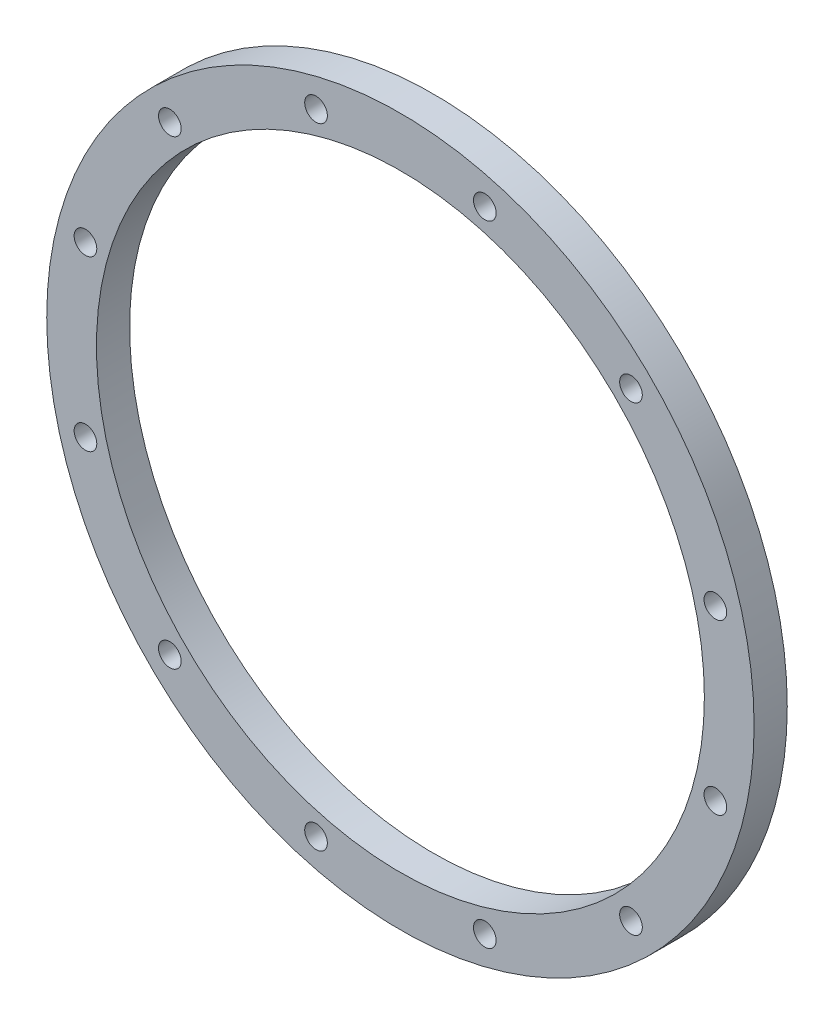
ISO-10303-21;
HEADER;
FILE_DESCRIPTION(('STEP AP214'),'2;1');
FILE_NAME('part.step','',(''),(''),'','','');
FILE_SCHEMA(('AUTOMOTIVE_DESIGN { 1 0 10303 214 1 1 1 1 }'));
ENDSEC;
DATA;
#1=APPLICATION_CONTEXT('core data for automotive mechanical design processes');
#2=APPLICATION_PROTOCOL_DEFINITION('international standard','automotive_design',2000,#1);
#3=PRODUCT_CONTEXT('',#1,'mechanical');
#4=PRODUCT('Part','Part','',(#3));
#5=PRODUCT_RELATED_PRODUCT_CATEGORY('part','',(#4));
#6=PRODUCT_DEFINITION_FORMATION('','',#4);
#7=PRODUCT_DEFINITION_CONTEXT('part definition',#1,'design');
#8=PRODUCT_DEFINITION('design','',#6,#7);
#9=PRODUCT_DEFINITION_SHAPE('','',#8);
#10=(LENGTH_UNIT() NAMED_UNIT(*) SI_UNIT(.MILLI.,.METRE.));
#11=(NAMED_UNIT(*) PLANE_ANGLE_UNIT() SI_UNIT($,.RADIAN.));
#12=(NAMED_UNIT(*) SI_UNIT($,.STERADIAN.) SOLID_ANGLE_UNIT());
#13=UNCERTAINTY_MEASURE_WITH_UNIT(LENGTH_MEASURE(1.E-05),#10,'distance_accuracy_value','');
#14=(GEOMETRIC_REPRESENTATION_CONTEXT(3) GLOBAL_UNCERTAINTY_ASSIGNED_CONTEXT((#13)) GLOBAL_UNIT_ASSIGNED_CONTEXT((#10,
#11,#12)) REPRESENTATION_CONTEXT('',''));
#15=CARTESIAN_POINT('',(0.,0.,0.));
#16=DIRECTION('',(0.,0.,1.));
#17=DIRECTION('',(1.,0.,0.));
#18=AXIS2_PLACEMENT_3D('',#15,#16,#17);
#19=CARTESIAN_POINT('',(-89.0727928211845,47.2587083204985,6.));
#20=DIRECTION('',(0.,0.,1.));
#21=DIRECTION('',(1.,0.,0.));
#22=AXIS2_PLACEMENT_3D('',#19,#20,#21);
#23=PLANE('',#22);
#24=CARTESIAN_POINT('',(-104.343116482235,104.248332071552,6.));
#25=DIRECTION('',(0.,0.,1.));
#26=DIRECTION('',(1.,0.,0.));
#27=AXIS2_PLACEMENT_3D('',#24,#25,#26);
#28=CIRCLE('',#27,2.04999999999999);
#29=CARTESIAN_POINT('',(-102.293116482235,104.248332071552,6.));
#30=VERTEX_POINT('',#29);
#31=EDGE_CURVE('E113',#30,#30,#28,.T.);
#32=ORIENTED_EDGE('',*,*,#31,.F.);
#33=EDGE_LOOP('',(#32));
#34=FACE_BOUND('',#33,.T.);
#35=CARTESIAN_POINT('',(-146.06241657224,62.5290319815441,6.));
#36=DIRECTION('',(0.,0.,1.));
#37=DIRECTION('',(1.,0.,0.));
#38=AXIS2_PLACEMENT_3D('',#35,#36,#37);
#39=CIRCLE('',#38,2.04999999999999);
#40=CARTESIAN_POINT('',(-144.01241657224,62.5290319815441,6.));
#41=VERTEX_POINT('',#40);
#42=EDGE_CURVE('E101',#41,#41,#39,.T.);
#43=ORIENTED_EDGE('',*,*,#42,.F.);
#44=EDGE_LOOP('',(#43));
#45=FACE_BOUND('',#44,.T.);
#46=CARTESIAN_POINT('',(-130.79209291119,5.53940823048934,6.));
#47=DIRECTION('',(0.,0.,1.));
#48=DIRECTION('',(1.,0.,0.));
#49=AXIS2_PLACEMENT_3D('',#46,#47,#48);
#50=CIRCLE('',#49,2.04999999999999);
#51=CARTESIAN_POINT('',(-128.74209291119,5.53940823048934,6.));
#52=VERTEX_POINT('',#51);
#53=EDGE_CURVE('E89',#52,#52,#50,.T.);
#54=ORIENTED_EDGE('',*,*,#53,.F.);
#55=EDGE_LOOP('',(#54));
#56=FACE_BOUND('',#55,.T.);
#57=CARTESIAN_POINT('',(-73.8024691601339,-9.73091543055785,6.));
#58=DIRECTION('',(0.,0.,1.));
#59=DIRECTION('',(1.,0.,0.));
#60=AXIS2_PLACEMENT_3D('',#57,#58,#59);
#61=CIRCLE('',#60,2.04999999999999);
#62=CARTESIAN_POINT('',(-71.7524691601339,-9.73091543055785,6.));
#63=VERTEX_POINT('',#62);
#64=EDGE_CURVE('E77',#63,#63,#61,.T.);
#65=ORIENTED_EDGE('',*,*,#64,.F.);
#66=EDGE_LOOP('',(#65));
#67=FACE_BOUND('',#66,.T.);
#68=CARTESIAN_POINT('',(-32.0831690701287,31.9883846594497,6.));
#69=DIRECTION('',(0.,0.,1.));
#70=DIRECTION('',(1.,0.,0.));
#71=AXIS2_PLACEMENT_3D('',#68,#69,#70);
#72=CIRCLE('',#71,2.05);
#73=CARTESIAN_POINT('',(-30.0331690701287,31.9883846594497,6.));
#74=VERTEX_POINT('',#73);
#75=EDGE_CURVE('E65',#74,#74,#72,.T.);
#76=ORIENTED_EDGE('',*,*,#75,.F.);
#77=EDGE_LOOP('',(#76));
#78=FACE_BOUND('',#77,.T.);
#79=CARTESIAN_POINT('',(-32.0831690701297,62.529031981548,6.));
#80=DIRECTION('',(0.,0.,1.));
#81=DIRECTION('',(1.,0.,0.));
#82=AXIS2_PLACEMENT_3D('',#79,#80,#81);
#83=CIRCLE('',#82,2.05);
#84=CARTESIAN_POINT('',(-30.0331690701297,62.529031981548,6.));
#85=VERTEX_POINT('',#84);
#86=EDGE_CURVE('E53',#85,#85,#83,.T.);
#87=ORIENTED_EDGE('',*,*,#86,.F.);
#88=EDGE_LOOP('',(#87));
#89=FACE_BOUND('',#88,.T.);
#90=CARTESIAN_POINT('',(-89.0727928211845,47.2587083204985,6.));
#91=DIRECTION('',(0.,0.,1.));
#92=DIRECTION('',(1.,0.,0.));
#93=AXIS2_PLACEMENT_3D('',#90,#91,#92);
#94=CIRCLE('',#93,64.);
#95=CARTESIAN_POINT('',(-25.0727928211845,47.2587083204985,6.));
#96=VERTEX_POINT('',#95);
#97=EDGE_CURVE('E10',#96,#96,#94,.T.);
#98=ORIENTED_EDGE('',*,*,#97,.T.);
#99=EDGE_LOOP('',(#98));
#100=FACE_BOUND('',#99,.T.);
#101=CARTESIAN_POINT('',(-89.0727928211845,47.2587083204985,6.));
#102=DIRECTION('',(0.,0.,1.));
#103=DIRECTION('',(1.,0.,0.));
#104=AXIS2_PLACEMENT_3D('',#101,#102,#103);
#105=CIRCLE('',#104,55.);
#106=CARTESIAN_POINT('',(-34.0727928211845,47.2587083204985,6.));
#107=VERTEX_POINT('',#106);
#108=EDGE_CURVE('E48',#107,#107,#105,.T.);
#109=ORIENTED_EDGE('',*,*,#108,.F.);
#110=EDGE_LOOP('',(#109));
#111=FACE_BOUND('',#110,.T.);
#112=CARTESIAN_POINT('',(-47.353492731179,88.9780084105044,6.));
#113=DIRECTION('',(0.,0.,1.));
#114=DIRECTION('',(1.,0.,0.));
#115=AXIS2_PLACEMENT_3D('',#112,#113,#114);
#116=CIRCLE('',#115,2.05);
#117=CARTESIAN_POINT('',(-45.303492731179,88.9780084105044,6.));
#118=VERTEX_POINT('',#117);
#119=EDGE_CURVE('E59',#118,#118,#116,.T.);
#120=ORIENTED_EDGE('',*,*,#119,.F.);
#121=EDGE_LOOP('',(#120));
#122=FACE_BOUND('',#121,.T.);
#123=CARTESIAN_POINT('',(-47.3534927311767,5.53940823049171,6.));
#124=DIRECTION('',(0.,0.,1.));
#125=DIRECTION('',(1.,0.,0.));
#126=AXIS2_PLACEMENT_3D('',#123,#124,#125);
#127=CIRCLE('',#126,2.05);
#128=CARTESIAN_POINT('',(-45.3034927311767,5.53940823049171,6.));
#129=VERTEX_POINT('',#128);
#130=EDGE_CURVE('E71',#129,#129,#127,.T.);
#131=ORIENTED_EDGE('',*,*,#130,.F.);
#132=EDGE_LOOP('',(#131));
#133=FACE_BOUND('',#132,.T.);
#134=CARTESIAN_POINT('',(-104.343116482231,-9.73091543055868,6.));
#135=DIRECTION('',(0.,0.,1.));
#136=DIRECTION('',(1.,0.,0.));
#137=AXIS2_PLACEMENT_3D('',#134,#135,#136);
#138=CIRCLE('',#137,2.04999999999999);
#139=CARTESIAN_POINT('',(-102.293116482231,-9.73091543055868,6.));
#140=VERTEX_POINT('',#139);
#141=EDGE_CURVE('E83',#140,#140,#138,.T.);
#142=ORIENTED_EDGE('',*,*,#141,.F.);
#143=EDGE_LOOP('',(#142));
#144=FACE_BOUND('',#143,.T.);
#145=CARTESIAN_POINT('',(-146.062416572239,31.9883846594466,6.));
#146=DIRECTION('',(0.,0.,1.));
#147=DIRECTION('',(1.,0.,0.));
#148=AXIS2_PLACEMENT_3D('',#145,#146,#147);
#149=CIRCLE('',#148,2.04999999999999);
#150=CARTESIAN_POINT('',(-144.012416572239,31.9883846594466,6.));
#151=VERTEX_POINT('',#150);
#152=EDGE_CURVE('E95',#151,#151,#149,.T.);
#153=ORIENTED_EDGE('',*,*,#152,.F.);
#154=EDGE_LOOP('',(#153));
#155=FACE_BOUND('',#154,.T.);
#156=CARTESIAN_POINT('',(-130.792092911192,88.9780084105021,6.));
#157=DIRECTION('',(0.,0.,1.));
#158=DIRECTION('',(1.,0.,0.));
#159=AXIS2_PLACEMENT_3D('',#156,#157,#158);
#160=CIRCLE('',#159,2.04999999999999);
#161=CARTESIAN_POINT('',(-128.742092911192,88.9780084105021,6.));
#162=VERTEX_POINT('',#161);
#163=EDGE_CURVE('E107',#162,#162,#160,.T.);
#164=ORIENTED_EDGE('',*,*,#163,.F.);
#165=EDGE_LOOP('',(#164));
#166=FACE_BOUND('',#165,.T.);
#167=CARTESIAN_POINT('',(-73.8024691601371,104.248332071552,6.));
#168=DIRECTION('',(0.,0.,1.));
#169=DIRECTION('',(1.,0.,0.));
#170=AXIS2_PLACEMENT_3D('',#167,#168,#169);
#171=CIRCLE('',#170,2.04999999999999);
#172=CARTESIAN_POINT('',(-71.7524691601371,104.248332071552,6.));
#173=VERTEX_POINT('',#172);
#174=EDGE_CURVE('E119',#173,#173,#171,.T.);
#175=ORIENTED_EDGE('',*,*,#174,.F.);
#176=EDGE_LOOP('',(#175));
#177=FACE_BOUND('',#176,.T.);
#178=ADVANCED_FACE('F37',(#34,#45,#56,#67,#78,#89,#100,#111,#122,#133,#144,#155,#166,#177),#23,.T.);
#179=CARTESIAN_POINT('',(-89.0727928211845,47.2587083204985,0.));
#180=DIRECTION('',(0.,0.,1.));
#181=DIRECTION('',(1.,0.,0.));
#182=AXIS2_PLACEMENT_3D('',#179,#180,#181);
#183=PLANE('',#182);
#184=CARTESIAN_POINT('',(-89.0727928211845,47.2587083204985,0.));
#185=DIRECTION('',(0.,0.,1.));
#186=DIRECTION('',(1.,0.,0.));
#187=AXIS2_PLACEMENT_3D('',#184,#185,#186);
#188=CIRCLE('',#187,64.);
#189=CARTESIAN_POINT('',(-25.0727928211845,47.2587083204985,0.));
#190=VERTEX_POINT('',#189);
#191=EDGE_CURVE('E41',#190,#190,#188,.T.);
#192=ORIENTED_EDGE('',*,*,#191,.F.);
#193=EDGE_LOOP('',(#192));
#194=FACE_BOUND('',#193,.T.);
#195=CARTESIAN_POINT('',(-89.0727928211845,47.2587083204985,0.));
#196=DIRECTION('',(0.,0.,1.));
#197=DIRECTION('',(1.,0.,0.));
#198=AXIS2_PLACEMENT_3D('',#195,#196,#197);
#199=CIRCLE('',#198,55.);
#200=CARTESIAN_POINT('',(-34.0727928211845,47.2587083204985,0.));
#201=VERTEX_POINT('',#200);
#202=EDGE_CURVE('E50',#201,#201,#199,.T.);
#203=ORIENTED_EDGE('',*,*,#202,.T.);
#204=EDGE_LOOP('',(#203));
#205=FACE_BOUND('',#204,.T.);
#206=CARTESIAN_POINT('',(-32.0831690701297,62.529031981548,0.));
#207=DIRECTION('',(0.,0.,1.));
#208=DIRECTION('',(1.,0.,0.));
#209=AXIS2_PLACEMENT_3D('',#206,#207,#208);
#210=CIRCLE('',#209,2.05);
#211=CARTESIAN_POINT('',(-30.0331690701297,62.529031981548,0.));
#212=VERTEX_POINT('',#211);
#213=EDGE_CURVE('E56',#212,#212,#210,.T.);
#214=ORIENTED_EDGE('',*,*,#213,.T.);
#215=EDGE_LOOP('',(#214));
#216=FACE_BOUND('',#215,.T.);
#217=CARTESIAN_POINT('',(-47.353492731179,88.9780084105044,0.));
#218=DIRECTION('',(0.,0.,1.));
#219=DIRECTION('',(1.,0.,0.));
#220=AXIS2_PLACEMENT_3D('',#217,#218,#219);
#221=CIRCLE('',#220,2.05);
#222=CARTESIAN_POINT('',(-45.303492731179,88.9780084105044,0.));
#223=VERTEX_POINT('',#222);
#224=EDGE_CURVE('E62',#223,#223,#221,.T.);
#225=ORIENTED_EDGE('',*,*,#224,.T.);
#226=EDGE_LOOP('',(#225));
#227=FACE_BOUND('',#226,.T.);
#228=CARTESIAN_POINT('',(-32.0831690701287,31.9883846594497,0.));
#229=DIRECTION('',(0.,0.,1.));
#230=DIRECTION('',(1.,0.,0.));
#231=AXIS2_PLACEMENT_3D('',#228,#229,#230);
#232=CIRCLE('',#231,2.05);
#233=CARTESIAN_POINT('',(-30.0331690701287,31.9883846594497,0.));
#234=VERTEX_POINT('',#233);
#235=EDGE_CURVE('E68',#234,#234,#232,.T.);
#236=ORIENTED_EDGE('',*,*,#235,.T.);
#237=EDGE_LOOP('',(#236));
#238=FACE_BOUND('',#237,.T.);
#239=CARTESIAN_POINT('',(-47.3534927311767,5.53940823049171,0.));
#240=DIRECTION('',(0.,0.,1.));
#241=DIRECTION('',(1.,0.,0.));
#242=AXIS2_PLACEMENT_3D('',#239,#240,#241);
#243=CIRCLE('',#242,2.05);
#244=CARTESIAN_POINT('',(-45.3034927311767,5.53940823049171,0.));
#245=VERTEX_POINT('',#244);
#246=EDGE_CURVE('E74',#245,#245,#243,.T.);
#247=ORIENTED_EDGE('',*,*,#246,.T.);
#248=EDGE_LOOP('',(#247));
#249=FACE_BOUND('',#248,.T.);
#250=CARTESIAN_POINT('',(-73.8024691601339,-9.73091543055785,0.));
#251=DIRECTION('',(0.,0.,1.));
#252=DIRECTION('',(1.,0.,0.));
#253=AXIS2_PLACEMENT_3D('',#250,#251,#252);
#254=CIRCLE('',#253,2.04999999999999);
#255=CARTESIAN_POINT('',(-71.7524691601339,-9.73091543055785,0.));
#256=VERTEX_POINT('',#255);
#257=EDGE_CURVE('E80',#256,#256,#254,.T.);
#258=ORIENTED_EDGE('',*,*,#257,.T.);
#259=EDGE_LOOP('',(#258));
#260=FACE_BOUND('',#259,.T.);
#261=CARTESIAN_POINT('',(-104.343116482231,-9.73091543055868,0.));
#262=DIRECTION('',(0.,0.,1.));
#263=DIRECTION('',(1.,0.,0.));
#264=AXIS2_PLACEMENT_3D('',#261,#262,#263);
#265=CIRCLE('',#264,2.04999999999999);
#266=CARTESIAN_POINT('',(-102.293116482231,-9.73091543055868,0.));
#267=VERTEX_POINT('',#266);
#268=EDGE_CURVE('E86',#267,#267,#265,.T.);
#269=ORIENTED_EDGE('',*,*,#268,.T.);
#270=EDGE_LOOP('',(#269));
#271=FACE_BOUND('',#270,.T.);
#272=CARTESIAN_POINT('',(-130.79209291119,5.53940823048934,0.));
#273=DIRECTION('',(0.,0.,1.));
#274=DIRECTION('',(1.,0.,0.));
#275=AXIS2_PLACEMENT_3D('',#272,#273,#274);
#276=CIRCLE('',#275,2.04999999999999);
#277=CARTESIAN_POINT('',(-128.74209291119,5.53940823048934,0.));
#278=VERTEX_POINT('',#277);
#279=EDGE_CURVE('E92',#278,#278,#276,.T.);
#280=ORIENTED_EDGE('',*,*,#279,.T.);
#281=EDGE_LOOP('',(#280));
#282=FACE_BOUND('',#281,.T.);
#283=CARTESIAN_POINT('',(-146.062416572239,31.9883846594466,0.));
#284=DIRECTION('',(0.,0.,1.));
#285=DIRECTION('',(1.,0.,0.));
#286=AXIS2_PLACEMENT_3D('',#283,#284,#285);
#287=CIRCLE('',#286,2.04999999999999);
#288=CARTESIAN_POINT('',(-144.012416572239,31.9883846594466,0.));
#289=VERTEX_POINT('',#288);
#290=EDGE_CURVE('E98',#289,#289,#287,.T.);
#291=ORIENTED_EDGE('',*,*,#290,.T.);
#292=EDGE_LOOP('',(#291));
#293=FACE_BOUND('',#292,.T.);
#294=CARTESIAN_POINT('',(-146.06241657224,62.5290319815441,0.));
#295=DIRECTION('',(0.,0.,1.));
#296=DIRECTION('',(1.,0.,0.));
#297=AXIS2_PLACEMENT_3D('',#294,#295,#296);
#298=CIRCLE('',#297,2.04999999999999);
#299=CARTESIAN_POINT('',(-144.01241657224,62.5290319815441,0.));
#300=VERTEX_POINT('',#299);
#301=EDGE_CURVE('E104',#300,#300,#298,.T.);
#302=ORIENTED_EDGE('',*,*,#301,.T.);
#303=EDGE_LOOP('',(#302));
#304=FACE_BOUND('',#303,.T.);
#305=CARTESIAN_POINT('',(-130.792092911192,88.9780084105021,0.));
#306=DIRECTION('',(0.,0.,1.));
#307=DIRECTION('',(1.,0.,0.));
#308=AXIS2_PLACEMENT_3D('',#305,#306,#307);
#309=CIRCLE('',#308,2.04999999999999);
#310=CARTESIAN_POINT('',(-128.742092911192,88.9780084105021,0.));
#311=VERTEX_POINT('',#310);
#312=EDGE_CURVE('E110',#311,#311,#309,.T.);
#313=ORIENTED_EDGE('',*,*,#312,.T.);
#314=EDGE_LOOP('',(#313));
#315=FACE_BOUND('',#314,.T.);
#316=CARTESIAN_POINT('',(-104.343116482235,104.248332071552,0.));
#317=DIRECTION('',(0.,0.,1.));
#318=DIRECTION('',(1.,0.,0.));
#319=AXIS2_PLACEMENT_3D('',#316,#317,#318);
#320=CIRCLE('',#319,2.04999999999999);
#321=CARTESIAN_POINT('',(-102.293116482235,104.248332071552,0.));
#322=VERTEX_POINT('',#321);
#323=EDGE_CURVE('E116',#322,#322,#320,.T.);
#324=ORIENTED_EDGE('',*,*,#323,.T.);
#325=EDGE_LOOP('',(#324));
#326=FACE_BOUND('',#325,.T.);
#327=CARTESIAN_POINT('',(-73.8024691601371,104.248332071552,0.));
#328=DIRECTION('',(0.,0.,1.));
#329=DIRECTION('',(1.,0.,0.));
#330=AXIS2_PLACEMENT_3D('',#327,#328,#329);
#331=CIRCLE('',#330,2.04999999999999);
#332=CARTESIAN_POINT('',(-71.7524691601371,104.248332071552,0.));
#333=VERTEX_POINT('',#332);
#334=EDGE_CURVE('E122',#333,#333,#331,.T.);
#335=ORIENTED_EDGE('',*,*,#334,.T.);
#336=EDGE_LOOP('',(#335));
#337=FACE_BOUND('',#336,.T.);
#338=ADVANCED_FACE('F132',(#194,#205,#216,#227,#238,#249,#260,#271,#282,#293,#304,#315,#326,
#337),#183,.F.);
#339=CARTESIAN_POINT('',(-89.0727928211845,47.2587083204985,6.));
#340=DIRECTION('',(0.,0.,-1.));
#341=DIRECTION('',(-1.,0.,0.));
#342=AXIS2_PLACEMENT_3D('',#339,#340,#341);
#343=CYLINDRICAL_SURFACE('',#342,64.);
#344=ORIENTED_EDGE('',*,*,#97,.F.);
#345=EDGE_LOOP('',(#344));
#346=FACE_BOUND('',#345,.T.);
#347=ORIENTED_EDGE('',*,*,#191,.T.);
#348=EDGE_LOOP('',(#347));
#349=FACE_BOUND('',#348,.T.);
#350=ADVANCED_FACE('F39',(#346,#349),#343,.T.);
#351=CARTESIAN_POINT('',(-89.0727928211845,47.2587083204985,6.));
#352=DIRECTION('',(0.,0.,-1.));
#353=DIRECTION('',(-1.,0.,0.));
#354=AXIS2_PLACEMENT_3D('',#351,#352,#353);
#355=CYLINDRICAL_SURFACE('',#354,55.);
#356=ORIENTED_EDGE('',*,*,#108,.T.);
#357=EDGE_LOOP('',(#356));
#358=FACE_BOUND('',#357,.T.);
#359=ORIENTED_EDGE('',*,*,#202,.F.);
#360=EDGE_LOOP('',(#359));
#361=FACE_BOUND('',#360,.T.);
#362=ADVANCED_FACE('F142',(#358,#361),#355,.F.);
#363=CARTESIAN_POINT('',(-32.0831690701297,62.529031981548,6.));
#364=DIRECTION('',(0.,0.,-1.));
#365=DIRECTION('',(-1.,0.,0.));
#366=AXIS2_PLACEMENT_3D('',#363,#364,#365);
#367=CYLINDRICAL_SURFACE('',#366,2.05);
#368=ORIENTED_EDGE('',*,*,#86,.T.);
#369=EDGE_LOOP('',(#368));
#370=FACE_BOUND('',#369,.T.);
#371=ORIENTED_EDGE('',*,*,#213,.F.);
#372=EDGE_LOOP('',(#371));
#373=FACE_BOUND('',#372,.T.);
#374=ADVANCED_FACE('F145',(#370,#373),#367,.F.);
#375=CARTESIAN_POINT('',(-47.353492731179,88.9780084105044,6.));
#376=DIRECTION('',(0.,0.,-1.));
#377=DIRECTION('',(-1.,0.,0.));
#378=AXIS2_PLACEMENT_3D('',#375,#376,#377);
#379=CYLINDRICAL_SURFACE('',#378,2.05);
#380=ORIENTED_EDGE('',*,*,#119,.T.);
#381=EDGE_LOOP('',(#380));
#382=FACE_BOUND('',#381,.T.);
#383=ORIENTED_EDGE('',*,*,#224,.F.);
#384=EDGE_LOOP('',(#383));
#385=FACE_BOUND('',#384,.T.);
#386=ADVANCED_FACE('F149',(#382,#385),#379,.F.);
#387=CARTESIAN_POINT('',(-32.0831690701287,31.9883846594497,6.));
#388=DIRECTION('',(0.,0.,-1.));
#389=DIRECTION('',(-1.,0.,0.));
#390=AXIS2_PLACEMENT_3D('',#387,#388,#389);
#391=CYLINDRICAL_SURFACE('',#390,2.05);
#392=ORIENTED_EDGE('',*,*,#75,.T.);
#393=EDGE_LOOP('',(#392));
#394=FACE_BOUND('',#393,.T.);
#395=ORIENTED_EDGE('',*,*,#235,.F.);
#396=EDGE_LOOP('',(#395));
#397=FACE_BOUND('',#396,.T.);
#398=ADVANCED_FACE('F153',(#394,#397),#391,.F.);
#399=CARTESIAN_POINT('',(-47.3534927311767,5.53940823049171,6.));
#400=DIRECTION('',(0.,0.,-1.));
#401=DIRECTION('',(-1.,0.,0.));
#402=AXIS2_PLACEMENT_3D('',#399,#400,#401);
#403=CYLINDRICAL_SURFACE('',#402,2.05);
#404=ORIENTED_EDGE('',*,*,#130,.T.);
#405=EDGE_LOOP('',(#404));
#406=FACE_BOUND('',#405,.T.);
#407=ORIENTED_EDGE('',*,*,#246,.F.);
#408=EDGE_LOOP('',(#407));
#409=FACE_BOUND('',#408,.T.);
#410=ADVANCED_FACE('F157',(#406,#409),#403,.F.);
#411=CARTESIAN_POINT('',(-73.8024691601339,-9.73091543055785,6.));
#412=DIRECTION('',(0.,0.,-1.));
#413=DIRECTION('',(-1.,0.,0.));
#414=AXIS2_PLACEMENT_3D('',#411,#412,#413);
#415=CYLINDRICAL_SURFACE('',#414,2.04999999999999);
#416=ORIENTED_EDGE('',*,*,#64,.T.);
#417=EDGE_LOOP('',(#416));
#418=FACE_BOUND('',#417,.T.);
#419=ORIENTED_EDGE('',*,*,#257,.F.);
#420=EDGE_LOOP('',(#419));
#421=FACE_BOUND('',#420,.T.);
#422=ADVANCED_FACE('F161',(#418,#421),#415,.F.);
#423=CARTESIAN_POINT('',(-104.343116482231,-9.73091543055868,6.));
#424=DIRECTION('',(0.,0.,-1.));
#425=DIRECTION('',(-1.,0.,0.));
#426=AXIS2_PLACEMENT_3D('',#423,#424,#425);
#427=CYLINDRICAL_SURFACE('',#426,2.04999999999999);
#428=ORIENTED_EDGE('',*,*,#141,.T.);
#429=EDGE_LOOP('',(#428));
#430=FACE_BOUND('',#429,.T.);
#431=ORIENTED_EDGE('',*,*,#268,.F.);
#432=EDGE_LOOP('',(#431));
#433=FACE_BOUND('',#432,.T.);
#434=ADVANCED_FACE('F165',(#430,#433),#427,.F.);
#435=CARTESIAN_POINT('',(-130.79209291119,5.53940823048934,6.));
#436=DIRECTION('',(0.,0.,-1.));
#437=DIRECTION('',(-1.,0.,0.));
#438=AXIS2_PLACEMENT_3D('',#435,#436,#437);
#439=CYLINDRICAL_SURFACE('',#438,2.04999999999999);
#440=ORIENTED_EDGE('',*,*,#53,.T.);
#441=EDGE_LOOP('',(#440));
#442=FACE_BOUND('',#441,.T.);
#443=ORIENTED_EDGE('',*,*,#279,.F.);
#444=EDGE_LOOP('',(#443));
#445=FACE_BOUND('',#444,.T.);
#446=ADVANCED_FACE('F169',(#442,#445),#439,.F.);
#447=CARTESIAN_POINT('',(-146.062416572239,31.9883846594466,6.));
#448=DIRECTION('',(0.,0.,-1.));
#449=DIRECTION('',(-1.,0.,0.));
#450=AXIS2_PLACEMENT_3D('',#447,#448,#449);
#451=CYLINDRICAL_SURFACE('',#450,2.04999999999999);
#452=ORIENTED_EDGE('',*,*,#152,.T.);
#453=EDGE_LOOP('',(#452));
#454=FACE_BOUND('',#453,.T.);
#455=ORIENTED_EDGE('',*,*,#290,.F.);
#456=EDGE_LOOP('',(#455));
#457=FACE_BOUND('',#456,.T.);
#458=ADVANCED_FACE('F173',(#454,#457),#451,.F.);
#459=CARTESIAN_POINT('',(-146.06241657224,62.5290319815441,6.));
#460=DIRECTION('',(0.,0.,-1.));
#461=DIRECTION('',(-1.,0.,0.));
#462=AXIS2_PLACEMENT_3D('',#459,#460,#461);
#463=CYLINDRICAL_SURFACE('',#462,2.04999999999999);
#464=ORIENTED_EDGE('',*,*,#42,.T.);
#465=EDGE_LOOP('',(#464));
#466=FACE_BOUND('',#465,.T.);
#467=ORIENTED_EDGE('',*,*,#301,.F.);
#468=EDGE_LOOP('',(#467));
#469=FACE_BOUND('',#468,.T.);
#470=ADVANCED_FACE('F177',(#466,#469),#463,.F.);
#471=CARTESIAN_POINT('',(-130.792092911192,88.9780084105021,6.));
#472=DIRECTION('',(0.,0.,-1.));
#473=DIRECTION('',(-1.,0.,0.));
#474=AXIS2_PLACEMENT_3D('',#471,#472,#473);
#475=CYLINDRICAL_SURFACE('',#474,2.04999999999999);
#476=ORIENTED_EDGE('',*,*,#163,.T.);
#477=EDGE_LOOP('',(#476));
#478=FACE_BOUND('',#477,.T.);
#479=ORIENTED_EDGE('',*,*,#312,.F.);
#480=EDGE_LOOP('',(#479));
#481=FACE_BOUND('',#480,.T.);
#482=ADVANCED_FACE('F181',(#478,#481),#475,.F.);
#483=CARTESIAN_POINT('',(-104.343116482235,104.248332071552,6.));
#484=DIRECTION('',(0.,0.,-1.));
#485=DIRECTION('',(-1.,0.,0.));
#486=AXIS2_PLACEMENT_3D('',#483,#484,#485);
#487=CYLINDRICAL_SURFACE('',#486,2.04999999999999);
#488=ORIENTED_EDGE('',*,*,#31,.T.);
#489=EDGE_LOOP('',(#488));
#490=FACE_BOUND('',#489,.T.);
#491=ORIENTED_EDGE('',*,*,#323,.F.);
#492=EDGE_LOOP('',(#491));
#493=FACE_BOUND('',#492,.T.);
#494=ADVANCED_FACE('F185',(#490,#493),#487,.F.);
#495=CARTESIAN_POINT('',(-73.8024691601371,104.248332071552,6.));
#496=DIRECTION('',(0.,0.,-1.));
#497=DIRECTION('',(-1.,0.,0.));
#498=AXIS2_PLACEMENT_3D('',#495,#496,#497);
#499=CYLINDRICAL_SURFACE('',#498,2.04999999999999);
#500=ORIENTED_EDGE('',*,*,#174,.T.);
#501=EDGE_LOOP('',(#500));
#502=FACE_BOUND('',#501,.T.);
#503=ORIENTED_EDGE('',*,*,#334,.F.);
#504=EDGE_LOOP('',(#503));
#505=FACE_BOUND('',#504,.T.);
#506=ADVANCED_FACE('F128',(#502,#505),#499,.F.);
#507=CLOSED_SHELL('',(#178,#338,#350,#362,#374,#386,#398,#410,#422,#434,#446,#458,#470,#482,
#494,#506));
#508=MANIFOLD_SOLID_BREP('B2',#507);
#509=ADVANCED_BREP_SHAPE_REPRESENTATION('',(#18,#508),#14);
#510=SHAPE_DEFINITION_REPRESENTATION(#9,#509);
ENDSEC;
END-ISO-10303-21;
